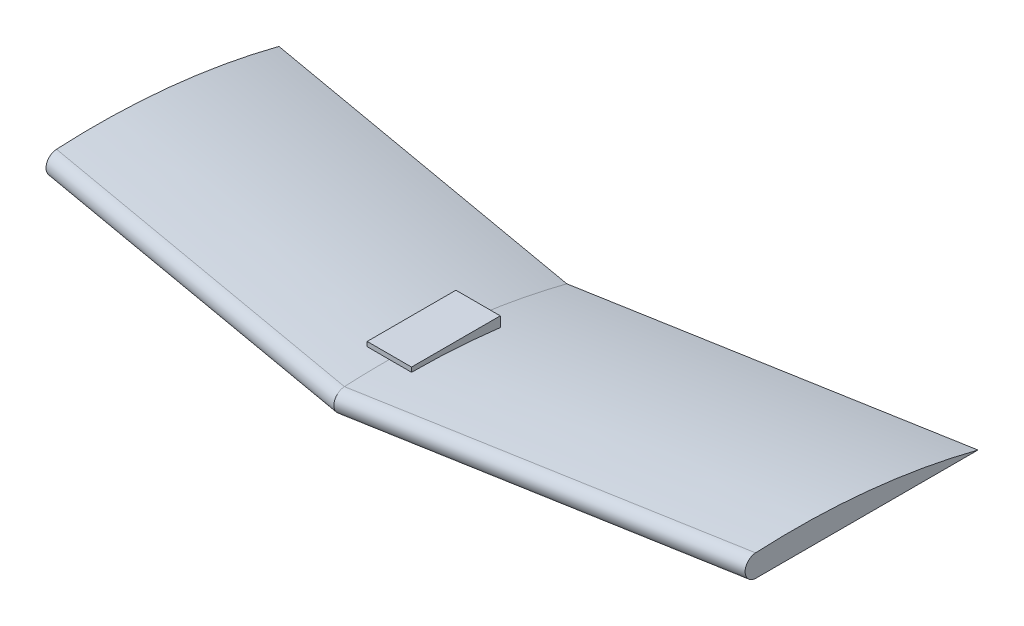
ISO-10303-21;
HEADER;
FILE_DESCRIPTION(('STEP AP214'),'2;1');
FILE_NAME('part.step','',(''),(''),'','','');
FILE_SCHEMA(('AUTOMOTIVE_DESIGN { 1 0 10303 214 1 1 1 1 }'));
ENDSEC;
DATA;
#1=APPLICATION_CONTEXT('core data for automotive mechanical design processes');
#2=APPLICATION_PROTOCOL_DEFINITION('international standard','automotive_design',2000,#1);
#3=PRODUCT_CONTEXT('',#1,'mechanical');
#4=PRODUCT('Part','Part','',(#3));
#5=PRODUCT_RELATED_PRODUCT_CATEGORY('part','',(#4));
#6=PRODUCT_DEFINITION_FORMATION('','',#4);
#7=PRODUCT_DEFINITION_CONTEXT('part definition',#1,'design');
#8=PRODUCT_DEFINITION('design','',#6,#7);
#9=PRODUCT_DEFINITION_SHAPE('','',#8);
#10=(LENGTH_UNIT() NAMED_UNIT(*) SI_UNIT(.MILLI.,.METRE.));
#11=(NAMED_UNIT(*) PLANE_ANGLE_UNIT() SI_UNIT($,.RADIAN.));
#12=(NAMED_UNIT(*) SI_UNIT($,.STERADIAN.) SOLID_ANGLE_UNIT());
#13=UNCERTAINTY_MEASURE_WITH_UNIT(LENGTH_MEASURE(1.E-05),#10,'distance_accuracy_value','');
#14=(GEOMETRIC_REPRESENTATION_CONTEXT(3) GLOBAL_UNCERTAINTY_ASSIGNED_CONTEXT((#13)) GLOBAL_UNIT_ASSIGNED_CONTEXT((#10,
#11,#12)) REPRESENTATION_CONTEXT('',''));
#15=CARTESIAN_POINT('',(0.,0.,0.));
#16=DIRECTION('',(0.,0.,1.));
#17=DIRECTION('',(1.,0.,0.));
#18=AXIS2_PLACEMENT_3D('',#15,#16,#17);
#19=CARTESIAN_POINT('',(-157.569240481953,-327.641885846705,-44.9969272839169));
#20=DIRECTION('',(1.,0.,0.));
#21=DIRECTION('',(0.,0.,-1.));
#22=AXIS2_PLACEMENT_3D('',#19,#20,#21);
#23=PLANE('',#22);
#24=CARTESIAN_POINT('',(-157.569240481953,-327.641885846705,-44.9969272839169));
#25=DIRECTION('',(1.,0.,0.));
#26=DIRECTION('',(0.,0.,-1.));
#27=AXIS2_PLACEMENT_3D('',#24,#25,#26);
#28=CIRCLE('',#27,333.093737009123);
#29=CARTESIAN_POINT('',(-157.569240481953,-4.99999999999999,-127.783708426708));
#30=VERTEX_POINT('',#29);
#31=CARTESIAN_POINT('',(-157.569240481953,4.99311399287078,-27.521386765007));
#32=VERTEX_POINT('',#31);
#33=EDGE_CURVE('E261',#30,#32,#28,.T.);
#34=ORIENTED_EDGE('',*,*,#33,.F.);
#35=DIRECTION('',(0.,0.,-1.));
#36=VECTOR('',#35,1.);
#37=CARTESIAN_POINT('',(-157.569240481953,-4.99999999999999,-127.783708426708));
#38=LINE('',#37,#36);
#39=CARTESIAN_POINT('',(-157.569240481953,-5.,-27.7837084267083));
#40=VERTEX_POINT('',#39);
#41=EDGE_CURVE('E36',#40,#30,#38,.T.);
#42=ORIENTED_EDGE('',*,*,#41,.F.);
#43=CARTESIAN_POINT('',(-157.569240481953,0.,-27.7837084267083));
#44=DIRECTION('',(1.,0.,0.));
#45=DIRECTION('',(0.,0.,-1.));
#46=AXIS2_PLACEMENT_3D('',#43,#44,#45);
#47=CIRCLE('',#46,4.99999999999998);
#48=EDGE_CURVE('E77',#32,#40,#47,.T.);
#49=ORIENTED_EDGE('',*,*,#48,.F.);
#50=EDGE_LOOP('',(#34,#42,#49));
#51=FACE_BOUND('',#50,.T.);
#52=ADVANCED_FACE('F33',(#51),#23,.F.);
#53=CARTESIAN_POINT('',(157.569240481953,-327.641885846705,-44.9969272839169));
#54=DIRECTION('',(1.,0.,0.));
#55=DIRECTION('',(0.,0.,-1.));
#56=AXIS2_PLACEMENT_3D('',#53,#54,#55);
#57=PLANE('',#56);
#58=CARTESIAN_POINT('',(157.569240481953,-327.641885846705,-44.9969272839169));
#59=DIRECTION('',(1.,0.,0.));
#60=DIRECTION('',(0.,0.,-1.));
#61=AXIS2_PLACEMENT_3D('',#58,#59,#60);
#62=CIRCLE('',#61,333.093737009123);
#63=CARTESIAN_POINT('',(157.569240481953,-4.99999999999999,-127.783708426708));
#64=VERTEX_POINT('',#63);
#65=CARTESIAN_POINT('',(157.569240481953,4.99311399287078,-27.521386765007));
#66=VERTEX_POINT('',#65);
#67=EDGE_CURVE('E86',#64,#66,#62,.T.);
#68=ORIENTED_EDGE('',*,*,#67,.T.);
#69=CARTESIAN_POINT('',(157.569240481953,0.,-27.7837084267084));
#70=DIRECTION('',(1.,0.,0.));
#71=DIRECTION('',(0.,0.,-1.));
#72=AXIS2_PLACEMENT_3D('',#69,#70,#71);
#73=CIRCLE('',#72,4.99999999999998);
#74=CARTESIAN_POINT('',(157.569240481953,-5.,-27.7837084267084));
#75=VERTEX_POINT('',#74);
#76=EDGE_CURVE('E106',#66,#75,#73,.T.);
#77=ORIENTED_EDGE('',*,*,#76,.T.);
#78=DIRECTION('',(0.,0.,-1.));
#79=VECTOR('',#78,1.);
#80=CARTESIAN_POINT('',(157.569240481953,-4.99999999999999,-127.783708426708));
#81=LINE('',#80,#79);
#82=EDGE_CURVE('E100',#75,#64,#81,.T.);
#83=ORIENTED_EDGE('',*,*,#82,.T.);
#84=EDGE_LOOP('',(#68,#77,#83));
#85=FACE_BOUND('',#84,.T.);
#86=ADVANCED_FACE('F108',(#85),#57,.T.);
#87=CARTESIAN_POINT('',(0.,-5.00000000000006,-100.));
#88=CARTESIAN_POINT('',(-157.569240481953,-5.00000000000006,-127.783708426708));
#89=CARTESIAN_POINT('',(0.,3.41203636443337,-67.2160791980715));
#90=CARTESIAN_POINT('',(-157.569240481953,3.41203636443337,-94.9997876247799));
#91=CARTESIAN_POINT('',(0.,6.76881876486384,-33.5370080876648));
#92=CARTESIAN_POINT('',(-157.569240481953,6.76881876486384,-61.3207165143732));
#93=CARTESIAN_POINT('',(0.,4.99311399287078,0.262321661701384));
#94=CARTESIAN_POINT('',(-157.569240481953,4.99311399287078,-27.521386765007));
#95=(BOUNDED_SURFACE() B_SPLINE_SURFACE(3,1,((#87,#88),(#89,#90),(#91,#92),(#93,#94)),
.UNSPECIFIED.,.F.,.F.,.F.) B_SPLINE_SURFACE_WITH_KNOTS((4,4),(2,2),(0.,1.),(0.,1.),
.UNSPECIFIED.) GEOMETRIC_REPRESENTATION_ITEM() RATIONAL_B_SPLINE_SURFACE(((1.,1.),
(0.992330631022271,0.992330631022271),(0.992330631022271,0.992330631022271),(1.,1.))) REPRESENTATION_ITEM('') SURFACE());
#96=CARTESIAN_POINT('',(-10.,5.45027866523353,-20.));
#97=CARTESIAN_POINT('',(-10.,5.44685263842594,-21.1150342486734));
#98=CARTESIAN_POINT('',(-10.,5.437827306516,-22.2300512856852));
#99=CARTESIAN_POINT('',(-10.,5.40858718919799,-24.4593776569469));
#100=CARTESIAN_POINT('',(-10.,5.3883780346019,-25.5736870650532));
#101=CARTESIAN_POINT('',(-10.,5.33678635539107,-27.8015986529232));
#102=CARTESIAN_POINT('',(-10.,5.30540832918029,-28.9152009368577));
#103=CARTESIAN_POINT('',(-10.,5.23149189971251,-31.1416986648984));
#104=CARTESIAN_POINT('',(-10.,5.1889568668054,-32.2545942208963));
#105=CARTESIAN_POINT('',(-10.,5.09273595672596,-34.4796787909731));
#106=CARTESIAN_POINT('',(-10.,5.03905232534234,-35.5918679021686));
#107=CARTESIAN_POINT('',(-10.,4.9205404023512,-37.8155397915218));
#108=CARTESIAN_POINT('',(-10.,4.85571323440748,-38.927022629566));
#109=CARTESIAN_POINT('',(-10.,4.71491703040844,-41.1492823878473));
#110=CARTESIAN_POINT('',(-10.,4.6389479943531,-42.2600593080843));
#111=CARTESIAN_POINT('',(-10.,4.47586747641328,-44.4809074550902));
#112=CARTESIAN_POINT('',(-10.,4.38875487229186,-45.5909785994514));
#113=CARTESIAN_POINT('',(-10.,4.20338329296664,-47.8104148308194));
#114=CARTESIAN_POINT('',(-10.,4.10512207767497,-48.91977973073));
#115=CARTESIAN_POINT('',(-10.,3.89744601672304,-51.1378028201552));
#116=CARTESIAN_POINT('',(-10.,3.78802781354119,-52.2464606953021));
#117=CARTESIAN_POINT('',(-10.,3.55802707481602,-54.4630687808498));
#118=CARTESIAN_POINT('',(-10.,3.4374400636916,-55.5710185268545));
#119=CARTESIAN_POINT('',(-10.,3.18508793338713,-57.7862091408636));
#120=CARTESIAN_POINT('',(-10.,3.05331721909879,-58.8934493714815));
#121=CARTESIAN_POINT('',(-9.99999999999999,2.91598980049806,-60.));
#122=B_SPLINE_CURVE_WITH_KNOTS('',3,(#96,#97,#98,#99,#100,#101,#102,#103,#104,#105,#106,#107,
#108,#109,#110,#111,#112,#113,#114,#115,#116,#117,#118,#119,#120,#121),.UNSPECIFIED.,.F.,.F.,(4,
2,2,2,2,2,2,2,2,2,2,2,4),(0.,3.34510446522767,6.68852627319474,10.0306029967389,
13.3716712937534,16.7120672131677,20.0521264995477,23.3921857859277,26.732581705342,
30.0736500023565,33.4157267259006,36.7591485338677,40.1042529990954),.UNSPECIFIED.);
#123=CARTESIAN_POINT('',(-10.,5.45027866523353,-20.));
#124=VERTEX_POINT('',#123);
#125=CARTESIAN_POINT('',(-10.,2.91598980049806,-60.));
#126=VERTEX_POINT('',#125);
#127=EDGE_CURVE('E159',#124,#126,#122,.T.);
#128=CARTESIAN_POINT('',(-10.,2.91598980049807,-60.));
#129=CARTESIAN_POINT('',(-8.33331552792127,2.87951823617212,-60.));
#130=CARTESIAN_POINT('',(-6.66663995854857,2.84264853121977,-60.));
#131=CARTESIAN_POINT('',(-3.33330662521524,2.76811284006224,-60.));
#132=CARTESIAN_POINT('',(-1.66664886125461,2.73044685385706,-60.));
#133=CARTESIAN_POINT('',(0.,2.69238272702548,-60.));
#134=B_SPLINE_CURVE_WITH_KNOTS('',3,(#128,#129,#130,#131,#132,#133),.UNSPECIFIED.,.F.,.F.,(4,2,
4),(0.,5.00124998957098,10.002499979142),.UNSPECIFIED.);
#135=CARTESIAN_POINT('',(0.,2.69238272702543,-60.));
#136=VERTEX_POINT('',#135);
#137=EDGE_CURVE('E239',#126,#136,#134,.T.);
#138=CARTESIAN_POINT('',(0.,-327.641885846705,-17.2132188572085));
#139=DIRECTION('',(1.,0.,0.));
#140=DIRECTION('',(0.,0.,-1.));
#141=AXIS2_PLACEMENT_3D('',#138,#139,#140);
#142=CIRCLE('',#141,333.093737009123);
#143=CARTESIAN_POINT('',(0.,-4.99999999999999,-100.));
#144=VERTEX_POINT('',#143);
#145=EDGE_CURVE('E252',#144,#136,#142,.T.);
#146=DIRECTION('',(-0.984807753012209,0.,-0.173648177666927));
#147=VECTOR('',#146,1.);
#148=CARTESIAN_POINT('',(0.,-4.99999999999999,-100.));
#149=LINE('',#148,#147);
#150=EDGE_CURVE('E97',#144,#30,#149,.T.);
#151=DIRECTION('',(-0.984807753012209,0.,-0.173648177666927));
#152=VECTOR('',#151,1.);
#153=CARTESIAN_POINT('',(0.,4.99311399287078,0.262321661701361));
#154=LINE('',#153,#152);
#155=CARTESIAN_POINT('',(0.,4.99311399287078,0.262321661701358));
#156=VERTEX_POINT('',#155);
#157=EDGE_CURVE('E251',#156,#32,#154,.T.);
#158=CARTESIAN_POINT('',(0.,5.44019335535117,-20.));
#159=VERTEX_POINT('',#158);
#160=EDGE_CURVE('E248',#159,#156,#142,.T.);
#161=CARTESIAN_POINT('',(0.,5.44019335535117,-20.));
#162=CARTESIAN_POINT('',(-1.66666588215265,5.44265211827847,-20.));
#163=CARTESIAN_POINT('',(-3.33333215656231,5.44472194223232,-20.));
#164=CARTESIAN_POINT('',(-6.66666548989565,5.4480837121931,-20.));
#165=CARTESIAN_POINT('',(-8.33333254881932,5.44937565820004,-20.));
#166=CARTESIAN_POINT('',(-10.,5.45027866523353,-20.));
#167=B_SPLINE_CURVE_WITH_KNOTS('',3,(#161,#162,#163,#164,#165,#166),.UNSPECIFIED.,.F.,.F.,(4,2,
4),(0.,5.00000267898248,10.000005357965),.UNSPECIFIED.);
#168=EDGE_CURVE('E49',#159,#124,#167,.T.);
#169=ORIENTED_EDGE('',*,*,#127,.T.);
#170=ORIENTED_EDGE('',*,*,#137,.T.);
#171=ORIENTED_EDGE('',*,*,#145,.F.);
#172=ORIENTED_EDGE('',*,*,#150,.T.);
#173=ORIENTED_EDGE('',*,*,#33,.T.);
#174=ORIENTED_EDGE('',*,*,#157,.F.);
#175=ORIENTED_EDGE('',*,*,#160,.F.);
#176=ORIENTED_EDGE('',*,*,#168,.T.);
#177=EDGE_LOOP('',(#169,#170,#171,#172,#173,#174,#175,#176));
#178=FACE_BOUND('',#177,.T.);
#179=ADVANCED_FACE('F134',(#178),#95,.F.);
#180=CARTESIAN_POINT('',(0.,4.99311399287078,0.262321661701361));
#181=CARTESIAN_POINT('',(-157.569240481953,4.99311399287078,-27.521386765007));
#182=CARTESIAN_POINT('',(0.,4.49480385025964,9.74731550370336));
#183=CARTESIAN_POINT('',(-157.569240481953,4.49480385025964,-18.036392923005));
#184=CARTESIAN_POINT('',(0.,-4.99999999999998,9.4980746038892));
#185=CARTESIAN_POINT('',(-157.569240481953,-4.99999999999998,-18.2856338228192));
#186=CARTESIAN_POINT('',(0.,-4.99999999999998,0.));
#187=CARTESIAN_POINT('',(-157.569240481953,-4.99999999999998,-27.7837084267084));
#188=(BOUNDED_SURFACE() B_SPLINE_SURFACE(3,1,((#180,#181),(#182,#183),(#184,#185),(#186,#187)),
.UNSPECIFIED.,.F.,.F.,.F.) B_SPLINE_SURFACE_WITH_KNOTS((4,4),(2,2),(0.,1.),(0.,1.),
.UNSPECIFIED.) GEOMETRIC_REPRESENTATION_ITEM() RATIONAL_B_SPLINE_SURFACE(((1.,1.),
(0.350827468387618,0.350827468387618),(0.350827468387618,0.350827468387618),(1.,1.))) REPRESENTATION_ITEM('') SURFACE());
#189=DIRECTION('',(-0.984807753012209,0.,-0.173648177666927));
#190=VECTOR('',#189,1.);
#191=CARTESIAN_POINT('',(0.,-5.,0.));
#192=LINE('',#191,#190);
#193=CARTESIAN_POINT('',(0.,-5.,0.));
#194=VERTEX_POINT('',#193);
#195=EDGE_CURVE('E265',#194,#40,#192,.T.);
#196=CARTESIAN_POINT('',(0.,0.,0.));
#197=DIRECTION('',(1.,0.,0.));
#198=DIRECTION('',(0.,0.,-1.));
#199=AXIS2_PLACEMENT_3D('',#196,#197,#198);
#200=CIRCLE('',#199,4.99999999999998);
#201=EDGE_CURVE('E41',#156,#194,#200,.T.);
#202=ORIENTED_EDGE('',*,*,#195,.F.);
#203=ORIENTED_EDGE('',*,*,#201,.F.);
#204=ORIENTED_EDGE('',*,*,#157,.T.);
#205=ORIENTED_EDGE('',*,*,#48,.T.);
#206=EDGE_LOOP('',(#202,#203,#204,#205));
#207=FACE_BOUND('',#206,.T.);
#208=ADVANCED_FACE('F120',(#207),#188,.F.);
#209=CARTESIAN_POINT('',(157.569240481953,-5.00000000000006,-127.783708426708));
#210=CARTESIAN_POINT('',(0.,-5.00000000000006,-100.));
#211=CARTESIAN_POINT('',(157.569240481953,3.41203636443337,-94.9997876247799));
#212=CARTESIAN_POINT('',(0.,3.41203636443337,-67.2160791980715));
#213=CARTESIAN_POINT('',(157.569240481953,6.76881876486384,-61.3207165143732));
#214=CARTESIAN_POINT('',(0.,6.76881876486384,-33.5370080876648));
#215=CARTESIAN_POINT('',(157.569240481953,4.99311399287078,-27.521386765007));
#216=CARTESIAN_POINT('',(0.,4.99311399287078,0.262321661701387));
#217=(BOUNDED_SURFACE() B_SPLINE_SURFACE(3,1,((#209,#210),(#211,#212),(#213,#214),(#215,#216)),
.UNSPECIFIED.,.F.,.F.,.F.) B_SPLINE_SURFACE_WITH_KNOTS((4,4),(2,2),(0.,1.),(0.,1.),
.UNSPECIFIED.) GEOMETRIC_REPRESENTATION_ITEM() RATIONAL_B_SPLINE_SURFACE(((1.,1.),
(0.992330631022271,0.992330631022271),(0.992330631022271,0.992330631022271),(1.,1.))) REPRESENTATION_ITEM('') SURFACE());
#218=CARTESIAN_POINT('',(0.,2.69238272702543,-60.));
#219=CARTESIAN_POINT('',(1.6666488612546,2.73044685385704,-60.));
#220=CARTESIAN_POINT('',(3.33330662521524,2.76811284006223,-60.));
#221=CARTESIAN_POINT('',(6.66663995854857,2.84264853121978,-60.));
#222=CARTESIAN_POINT('',(8.33331552792127,2.87951823617213,-60.));
#223=CARTESIAN_POINT('',(10.,2.91598980049806,-60.));
#224=B_SPLINE_CURVE_WITH_KNOTS('',3,(#218,#219,#220,#221,#222,#223),.UNSPECIFIED.,.F.,.F.,(4,2,
4),(0.,5.00124998957098,10.002499979142),.UNSPECIFIED.);
#225=CARTESIAN_POINT('',(10.,2.91598980049807,-60.));
#226=VERTEX_POINT('',#225);
#227=EDGE_CURVE('E167',#136,#226,#224,.T.);
#228=CARTESIAN_POINT('',(10.,2.91598980049807,-60.));
#229=CARTESIAN_POINT('',(10.,3.05331721909879,-58.8934493714815));
#230=CARTESIAN_POINT('',(10.,3.18508793338713,-57.7862091408636));
#231=CARTESIAN_POINT('',(10.,3.43744006369161,-55.5710185268545));
#232=CARTESIAN_POINT('',(10.,3.55802707481602,-54.4630687808497));
#233=CARTESIAN_POINT('',(10.,3.78802781354119,-52.2464606953021));
#234=CARTESIAN_POINT('',(10.,3.89744601672304,-51.1378028201552));
#235=CARTESIAN_POINT('',(10.,4.10512207767497,-48.91977973073));
#236=CARTESIAN_POINT('',(10.,4.20338329296664,-47.8104148308194));
#237=CARTESIAN_POINT('',(10.,4.38875487229187,-45.5909785994514));
#238=CARTESIAN_POINT('',(10.,4.47586747641328,-44.4809074550902));
#239=CARTESIAN_POINT('',(10.,4.6389479943531,-42.2600593080843));
#240=CARTESIAN_POINT('',(10.,4.71491703040844,-41.1492823878473));
#241=CARTESIAN_POINT('',(10.,4.85571323440749,-38.927022629566));
#242=CARTESIAN_POINT('',(10.,4.9205404023512,-37.8155397915218));
#243=CARTESIAN_POINT('',(10.,5.03905232534234,-35.5918679021686));
#244=CARTESIAN_POINT('',(10.,5.09273595672596,-34.4796787909731));
#245=CARTESIAN_POINT('',(10.,5.1889568668054,-32.2545942208963));
#246=CARTESIAN_POINT('',(10.,5.23149189971251,-31.1416986648984));
#247=CARTESIAN_POINT('',(10.,5.30540832918029,-28.9152009368576));
#248=CARTESIAN_POINT('',(10.,5.33678635539107,-27.8015986529232));
#249=CARTESIAN_POINT('',(10.,5.3883780346019,-25.5736870650532));
#250=CARTESIAN_POINT('',(10.,5.40858718919799,-24.4593776569469));
#251=CARTESIAN_POINT('',(10.,5.437827306516,-22.2300512856852));
#252=CARTESIAN_POINT('',(10.,5.44685263842594,-21.1150342486734));
#253=CARTESIAN_POINT('',(10.,5.45027866523353,-20.));
#254=B_SPLINE_CURVE_WITH_KNOTS('',3,(#228,#229,#230,#231,#232,#233,#234,#235,#236,#237,#238,
#239,#240,#241,#242,#243,#244,#245,#246,#247,#248,#249,#250,#251,#252,#253),.UNSPECIFIED.,.F.,
.F.,(4,2,2,2,2,2,2,2,2,2,2,2,4),(0.,3.34510446522767,6.68852627319475,10.0306029967389,
13.3716712937534,16.7120672131677,20.0521264995477,23.3921857859277,26.732581705342,
30.0736500023565,33.4157267259007,36.7591485338677,40.1042529990954),.UNSPECIFIED.);
#255=CARTESIAN_POINT('',(10.,5.45027866523353,-20.));
#256=VERTEX_POINT('',#255);
#257=EDGE_CURVE('E250',#226,#256,#254,.T.);
#258=CARTESIAN_POINT('',(9.99999999999999,5.45027866523353,-20.));
#259=CARTESIAN_POINT('',(8.33333254881931,5.44937565820004,-20.));
#260=CARTESIAN_POINT('',(6.66666548989563,5.4480837121931,-20.));
#261=CARTESIAN_POINT('',(3.33333215656229,5.44472194223232,-20.));
#262=CARTESIAN_POINT('',(1.66666588215263,5.44265211827847,-20.));
#263=CARTESIAN_POINT('',(0.,5.44019335535117,-20.));
#264=B_SPLINE_CURVE_WITH_KNOTS('',3,(#258,#259,#260,#261,#262,#263),.UNSPECIFIED.,.F.,.F.,(4,2,
4),(0.,5.00000267898249,10.000005357965),.UNSPECIFIED.);
#265=EDGE_CURVE('E186',#256,#159,#264,.T.);
#266=DIRECTION('',(-0.984807753012209,0.,0.173648177666927));
#267=VECTOR('',#266,1.);
#268=CARTESIAN_POINT('',(157.569240481953,4.99311399287078,-27.521386765007));
#269=LINE('',#268,#267);
#270=EDGE_CURVE('E254',#66,#156,#269,.T.);
#271=DIRECTION('',(-0.984807753012209,0.,0.173648177666927));
#272=VECTOR('',#271,1.);
#273=CARTESIAN_POINT('',(157.569240481953,-4.99999999999999,-127.783708426708));
#274=LINE('',#273,#272);
#275=EDGE_CURVE('E104',#64,#144,#274,.T.);
#276=ORIENTED_EDGE('',*,*,#145,.T.);
#277=ORIENTED_EDGE('',*,*,#227,.T.);
#278=ORIENTED_EDGE('',*,*,#257,.T.);
#279=ORIENTED_EDGE('',*,*,#265,.T.);
#280=ORIENTED_EDGE('',*,*,#160,.T.);
#281=ORIENTED_EDGE('',*,*,#270,.F.);
#282=ORIENTED_EDGE('',*,*,#67,.F.);
#283=ORIENTED_EDGE('',*,*,#275,.T.);
#284=EDGE_LOOP('',(#276,#277,#278,#279,#280,#281,#282,#283));
#285=FACE_BOUND('',#284,.T.);
#286=ADVANCED_FACE('F112',(#285),#217,.F.);
#287=CARTESIAN_POINT('',(157.569240481953,4.99311399287078,-27.521386765007));
#288=CARTESIAN_POINT('',(0.,4.99311399287078,0.262321661701363));
#289=CARTESIAN_POINT('',(157.569240481953,4.49480385025964,-18.036392923005));
#290=CARTESIAN_POINT('',(0.,4.49480385025964,9.74731550370336));
#291=CARTESIAN_POINT('',(157.569240481953,-4.99999999999998,-18.2856338228192));
#292=CARTESIAN_POINT('',(0.,-4.99999999999998,9.49807460388921));
#293=CARTESIAN_POINT('',(157.569240481953,-4.99999999999998,-27.7837084267084));
#294=CARTESIAN_POINT('',(0.,-4.99999999999998,0.));
#295=(BOUNDED_SURFACE() B_SPLINE_SURFACE(3,1,((#287,#288),(#289,#290),(#291,#292),(#293,#294)),
.UNSPECIFIED.,.F.,.F.,.F.) B_SPLINE_SURFACE_WITH_KNOTS((4,4),(2,2),(0.,1.),(0.,1.),
.UNSPECIFIED.) GEOMETRIC_REPRESENTATION_ITEM() RATIONAL_B_SPLINE_SURFACE(((1.,1.),
(0.350827468387618,0.350827468387618),(0.350827468387618,0.350827468387618),(1.,1.))) REPRESENTATION_ITEM('') SURFACE());
#296=DIRECTION('',(-0.984807753012209,0.,0.173648177666927));
#297=VECTOR('',#296,1.);
#298=CARTESIAN_POINT('',(157.569240481953,-5.,-27.7837084267084));
#299=LINE('',#298,#297);
#300=EDGE_CURVE('E11',#75,#194,#299,.T.);
#301=ORIENTED_EDGE('',*,*,#300,.F.);
#302=ORIENTED_EDGE('',*,*,#76,.F.);
#303=ORIENTED_EDGE('',*,*,#270,.T.);
#304=ORIENTED_EDGE('',*,*,#201,.T.);
#305=EDGE_LOOP('',(#301,#302,#303,#304));
#306=FACE_BOUND('',#305,.T.);
#307=ADVANCED_FACE('F110',(#306),#295,.F.);
#308=CARTESIAN_POINT('',(157.569240481953,-4.99999999999999,-127.783708426708));
#309=DIRECTION('',(0.,1.,0.));
#310=DIRECTION('',(0.,0.,1.));
#311=AXIS2_PLACEMENT_3D('',#308,#309,#310);
#312=PLANE('',#311);
#313=ORIENTED_EDGE('',*,*,#300,.T.);
#314=ORIENTED_EDGE('',*,*,#195,.T.);
#315=ORIENTED_EDGE('',*,*,#41,.T.);
#316=ORIENTED_EDGE('',*,*,#150,.F.);
#317=ORIENTED_EDGE('',*,*,#275,.F.);
#318=ORIENTED_EDGE('',*,*,#82,.F.);
#319=EDGE_LOOP('',(#313,#314,#315,#316,#317,#318));
#320=FACE_BOUND('',#319,.T.);
#321=ADVANCED_FACE('F102',(#320),#312,.F.);
#322=CARTESIAN_POINT('',(10.,7.5,-20.));
#323=DIRECTION('',(1.,0.,0.));
#324=DIRECTION('',(0.,0.,-1.));
#325=AXIS2_PLACEMENT_3D('',#322,#323,#324);
#326=PLANE('',#325);
#327=ORIENTED_EDGE('',*,*,#257,.F.);
#328=DIRECTION('',(0.,-1.,0.));
#329=VECTOR('',#328,1.);
#330=CARTESIAN_POINT('',(10.,7.50000000000001,-60.));
#331=LINE('',#330,#329);
#332=CARTESIAN_POINT('',(10.,7.50000000000001,-60.));
#333=VERTEX_POINT('',#332);
#334=EDGE_CURVE('E192',#333,#226,#331,.T.);
#335=ORIENTED_EDGE('',*,*,#334,.F.);
#336=DIRECTION('',(0.,0.,1.));
#337=VECTOR('',#336,1.);
#338=CARTESIAN_POINT('',(10.,7.5,-20.));
#339=LINE('',#338,#337);
#340=CARTESIAN_POINT('',(10.,7.5,-20.));
#341=VERTEX_POINT('',#340);
#342=EDGE_CURVE('E212',#333,#341,#339,.T.);
#343=ORIENTED_EDGE('',*,*,#342,.T.);
#344=DIRECTION('',(0.,-1.,0.));
#345=VECTOR('',#344,1.);
#346=CARTESIAN_POINT('',(10.,7.5,-20.));
#347=LINE('',#346,#345);
#348=EDGE_CURVE('E193',#341,#256,#347,.T.);
#349=ORIENTED_EDGE('',*,*,#348,.T.);
#350=EDGE_LOOP('',(#327,#335,#343,#349));
#351=FACE_BOUND('',#350,.T.);
#352=ADVANCED_FACE('F118',(#351),#326,.T.);
#353=CARTESIAN_POINT('',(-10.,7.50000000000001,-60.));
#354=DIRECTION('',(0.,0.,-1.));
#355=DIRECTION('',(0.,1.,0.));
#356=AXIS2_PLACEMENT_3D('',#353,#354,#355);
#357=PLANE('',#356);
#358=ORIENTED_EDGE('',*,*,#137,.F.);
#359=DIRECTION('',(0.,-1.,0.));
#360=VECTOR('',#359,1.);
#361=CARTESIAN_POINT('',(-10.,7.50000000000001,-60.));
#362=LINE('',#361,#360);
#363=CARTESIAN_POINT('',(-10.,7.50000000000001,-60.));
#364=VERTEX_POINT('',#363);
#365=EDGE_CURVE('E199',#364,#126,#362,.T.);
#366=ORIENTED_EDGE('',*,*,#365,.F.);
#367=DIRECTION('',(1.,0.,0.));
#368=VECTOR('',#367,1.);
#369=CARTESIAN_POINT('',(-10.,7.50000000000001,-60.));
#370=LINE('',#369,#368);
#371=EDGE_CURVE('E197',#364,#333,#370,.T.);
#372=ORIENTED_EDGE('',*,*,#371,.T.);
#373=ORIENTED_EDGE('',*,*,#334,.T.);
#374=ORIENTED_EDGE('',*,*,#227,.F.);
#375=EDGE_LOOP('',(#358,#366,#372,#373,#374));
#376=FACE_BOUND('',#375,.T.);
#377=ADVANCED_FACE('F177',(#376),#357,.T.);
#378=CARTESIAN_POINT('',(-10.,7.5,-20.));
#379=DIRECTION('',(-1.,0.,0.));
#380=DIRECTION('',(0.,0.,1.));
#381=AXIS2_PLACEMENT_3D('',#378,#379,#380);
#382=PLANE('',#381);
#383=ORIENTED_EDGE('',*,*,#127,.F.);
#384=DIRECTION('',(0.,-1.,0.));
#385=VECTOR('',#384,1.);
#386=CARTESIAN_POINT('',(-10.,7.5,-20.));
#387=LINE('',#386,#385);
#388=CARTESIAN_POINT('',(-10.,7.5,-20.));
#389=VERTEX_POINT('',#388);
#390=EDGE_CURVE('E196',#389,#124,#387,.T.);
#391=ORIENTED_EDGE('',*,*,#390,.F.);
#392=DIRECTION('',(0.,0.,-1.));
#393=VECTOR('',#392,1.);
#394=CARTESIAN_POINT('',(-10.,7.5,-20.));
#395=LINE('',#394,#393);
#396=EDGE_CURVE('E206',#389,#364,#395,.T.);
#397=ORIENTED_EDGE('',*,*,#396,.T.);
#398=ORIENTED_EDGE('',*,*,#365,.T.);
#399=EDGE_LOOP('',(#383,#391,#397,#398));
#400=FACE_BOUND('',#399,.T.);
#401=ADVANCED_FACE('F173',(#400),#382,.T.);
#402=CARTESIAN_POINT('',(-10.,7.5,-20.));
#403=DIRECTION('',(0.,0.,1.));
#404=DIRECTION('',(1.,0.,0.));
#405=AXIS2_PLACEMENT_3D('',#402,#403,#404);
#406=PLANE('',#405);
#407=ORIENTED_EDGE('',*,*,#168,.F.);
#408=ORIENTED_EDGE('',*,*,#265,.F.);
#409=ORIENTED_EDGE('',*,*,#348,.F.);
#410=DIRECTION('',(-1.,0.,0.));
#411=VECTOR('',#410,1.);
#412=CARTESIAN_POINT('',(-10.,7.5,-20.));
#413=LINE('',#412,#411);
#414=EDGE_CURVE('E209',#341,#389,#413,.T.);
#415=ORIENTED_EDGE('',*,*,#414,.T.);
#416=ORIENTED_EDGE('',*,*,#390,.T.);
#417=EDGE_LOOP('',(#407,#408,#409,#415,#416));
#418=FACE_BOUND('',#417,.T.);
#419=ADVANCED_FACE('F176',(#418),#406,.T.);
#420=CARTESIAN_POINT('',(0.,7.5,0.));
#421=DIRECTION('',(0.,-1.,0.));
#422=DIRECTION('',(0.,0.,-1.));
#423=AXIS2_PLACEMENT_3D('',#420,#421,#422);
#424=PLANE('',#423);
#425=ORIENTED_EDGE('',*,*,#342,.F.);
#426=ORIENTED_EDGE('',*,*,#371,.F.);
#427=ORIENTED_EDGE('',*,*,#396,.F.);
#428=ORIENTED_EDGE('',*,*,#414,.F.);
#429=EDGE_LOOP('',(#425,#426,#427,#428));
#430=FACE_BOUND('',#429,.T.);
#431=ADVANCED_FACE('F183',(#430),#424,.F.);
#432=CLOSED_SHELL('',(#52,#86,#179,#208,#286,#307,#321,#352,#377,#401,#419,#431));
#433=MANIFOLD_SOLID_BREP('B2',#432);
#434=ADVANCED_BREP_SHAPE_REPRESENTATION('',(#18,#433),#14);
#435=SHAPE_DEFINITION_REPRESENTATION(#9,#434);
ENDSEC;
END-ISO-10303-21;
